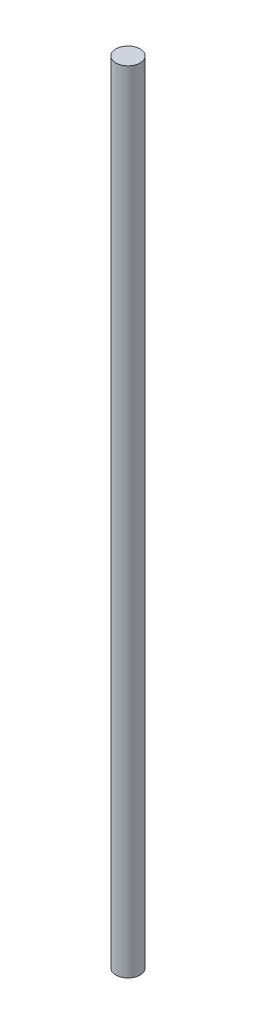
ISO-10303-21;
HEADER;
FILE_DESCRIPTION(('STEP AP214'),'2;1');
FILE_NAME('part.step','',(''),(''),'','','');
FILE_SCHEMA(('AUTOMOTIVE_DESIGN { 1 0 10303 214 1 1 1 1 }'));
ENDSEC;
DATA;
#1=APPLICATION_CONTEXT('core data for automotive mechanical design processes');
#2=APPLICATION_PROTOCOL_DEFINITION('international standard','automotive_design',2000,#1);
#3=PRODUCT_CONTEXT('',#1,'mechanical');
#4=PRODUCT('Part','Part','',(#3));
#5=PRODUCT_RELATED_PRODUCT_CATEGORY('part','',(#4));
#6=PRODUCT_DEFINITION_FORMATION('','',#4);
#7=PRODUCT_DEFINITION_CONTEXT('part definition',#1,'design');
#8=PRODUCT_DEFINITION('design','',#6,#7);
#9=PRODUCT_DEFINITION_SHAPE('','',#8);
#10=(LENGTH_UNIT() NAMED_UNIT(*) SI_UNIT(.MILLI.,.METRE.));
#11=(NAMED_UNIT(*) PLANE_ANGLE_UNIT() SI_UNIT($,.RADIAN.));
#12=(NAMED_UNIT(*) SI_UNIT($,.STERADIAN.) SOLID_ANGLE_UNIT());
#13=UNCERTAINTY_MEASURE_WITH_UNIT(LENGTH_MEASURE(1.E-05),#10,'distance_accuracy_value','');
#14=(GEOMETRIC_REPRESENTATION_CONTEXT(3) GLOBAL_UNCERTAINTY_ASSIGNED_CONTEXT((#13)) GLOBAL_UNIT_ASSIGNED_CONTEXT((#10,
#11,#12)) REPRESENTATION_CONTEXT('',''));
#15=CARTESIAN_POINT('',(0.,0.,0.));
#16=DIRECTION('',(0.,0.,1.));
#17=DIRECTION('',(1.,0.,0.));
#18=AXIS2_PLACEMENT_3D('',#15,#16,#17);
#19=CARTESIAN_POINT('',(0.,130.,0.));
#20=DIRECTION('',(0.,-1.,0.));
#21=DIRECTION('',(0.,0.,-1.));
#22=AXIS2_PLACEMENT_3D('',#19,#20,#21);
#23=CYLINDRICAL_SURFACE('',#22,2.);
#24=CARTESIAN_POINT('',(0.,130.,0.));
#25=DIRECTION('',(0.,1.,0.));
#26=DIRECTION('',(0.,0.,1.));
#27=AXIS2_PLACEMENT_3D('',#24,#25,#26);
#28=CIRCLE('',#27,2.);
#29=CARTESIAN_POINT('',(0.,130.,2.));
#30=VERTEX_POINT('',#29);
#31=EDGE_CURVE('E10',#30,#30,#28,.T.);
#32=ORIENTED_EDGE('',*,*,#31,.F.);
#33=EDGE_LOOP('',(#32));
#34=FACE_BOUND('',#33,.T.);
#35=CARTESIAN_POINT('',(0.,0.,0.));
#36=DIRECTION('',(0.,1.,0.));
#37=DIRECTION('',(0.,0.,1.));
#38=AXIS2_PLACEMENT_3D('',#35,#36,#37);
#39=CIRCLE('',#38,2.);
#40=CARTESIAN_POINT('',(0.,0.,2.));
#41=VERTEX_POINT('',#40);
#42=EDGE_CURVE('E34',#41,#41,#39,.T.);
#43=ORIENTED_EDGE('',*,*,#42,.T.);
#44=EDGE_LOOP('',(#43));
#45=FACE_BOUND('',#44,.T.);
#46=ADVANCED_FACE('F31',(#34,#45),#23,.T.);
#47=CARTESIAN_POINT('',(0.,130.,0.));
#48=DIRECTION('',(0.,1.,0.));
#49=DIRECTION('',(0.,0.,1.));
#50=AXIS2_PLACEMENT_3D('',#47,#48,#49);
#51=PLANE('',#50);
#52=ORIENTED_EDGE('',*,*,#31,.T.);
#53=EDGE_LOOP('',(#52));
#54=FACE_BOUND('',#53,.T.);
#55=ADVANCED_FACE('F46',(#54),#51,.T.);
#56=CARTESIAN_POINT('',(0.,0.,0.));
#57=DIRECTION('',(0.,1.,0.));
#58=DIRECTION('',(0.,0.,1.));
#59=AXIS2_PLACEMENT_3D('',#56,#57,#58);
#60=PLANE('',#59);
#61=ORIENTED_EDGE('',*,*,#42,.F.);
#62=EDGE_LOOP('',(#61));
#63=FACE_BOUND('',#62,.T.);
#64=ADVANCED_FACE('F44',(#63),#60,.F.);
#65=CLOSED_SHELL('',(#46,#55,#64));
#66=MANIFOLD_SOLID_BREP('B2',#65);
#67=ADVANCED_BREP_SHAPE_REPRESENTATION('',(#18,#66),#14);
#68=SHAPE_DEFINITION_REPRESENTATION(#9,#67);
ENDSEC;
END-ISO-10303-21;
